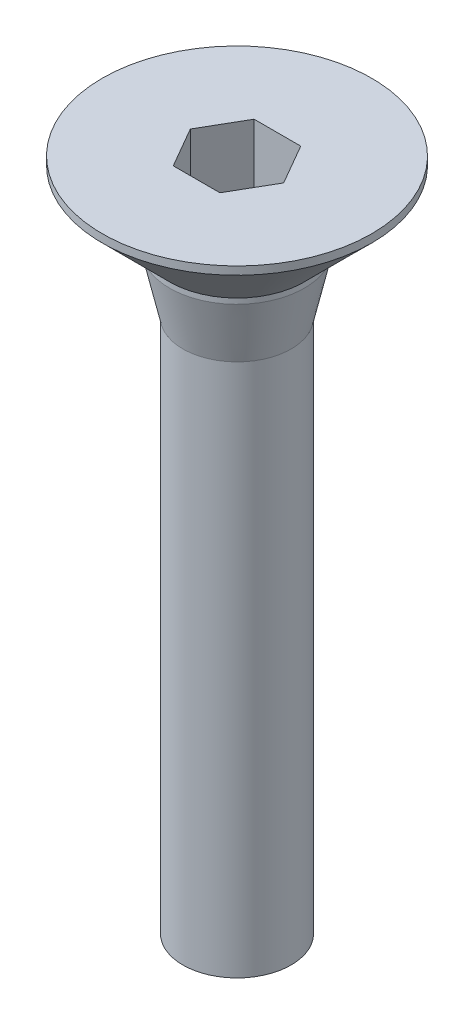
ISO-10303-21;
HEADER;
FILE_DESCRIPTION(('STEP AP214'),'2;1');
FILE_NAME('part.step','',(''),(''),'','','');
FILE_SCHEMA(('AUTOMOTIVE_DESIGN { 1 0 10303 214 1 1 1 1 }'));
ENDSEC;
DATA;
#1=APPLICATION_CONTEXT('core data for automotive mechanical design processes');
#2=APPLICATION_PROTOCOL_DEFINITION('international standard','automotive_design',2000,#1);
#3=PRODUCT_CONTEXT('',#1,'mechanical');
#4=PRODUCT('Part','Part','',(#3));
#5=PRODUCT_RELATED_PRODUCT_CATEGORY('part','',(#4));
#6=PRODUCT_DEFINITION_FORMATION('','',#4);
#7=PRODUCT_DEFINITION_CONTEXT('part definition',#1,'design');
#8=PRODUCT_DEFINITION('design','',#6,#7);
#9=PRODUCT_DEFINITION_SHAPE('','',#8);
#10=(LENGTH_UNIT() NAMED_UNIT(*) SI_UNIT(.MILLI.,.METRE.));
#11=(NAMED_UNIT(*) PLANE_ANGLE_UNIT() SI_UNIT($,.RADIAN.));
#12=(NAMED_UNIT(*) SI_UNIT($,.STERADIAN.) SOLID_ANGLE_UNIT());
#13=UNCERTAINTY_MEASURE_WITH_UNIT(LENGTH_MEASURE(1.E-05),#10,'distance_accuracy_value','');
#14=(GEOMETRIC_REPRESENTATION_CONTEXT(3) GLOBAL_UNCERTAINTY_ASSIGNED_CONTEXT((#13)) GLOBAL_UNIT_ASSIGNED_CONTEXT((#10,
#11,#12)) REPRESENTATION_CONTEXT('',''));
#15=CARTESIAN_POINT('',(0.,0.,0.));
#16=DIRECTION('',(0.,0.,1.));
#17=DIRECTION('',(1.,0.,0.));
#18=AXIS2_PLACEMENT_3D('',#15,#16,#17);
#19=CARTESIAN_POINT('',(0.,0.,0.));
#20=DIRECTION('',(0.,-1.,0.));
#21=DIRECTION('',(1.,0.,0.));
#22=AXIS2_PLACEMENT_3D('',#19,#20,#21);
#23=PLANE('',#22);
#24=DIRECTION('',(1.,0.,0.));
#25=VECTOR('',#24,1.);
#26=CARTESIAN_POINT('',(-0.866025403784437,0.,1.5));
#27=LINE('',#26,#25);
#28=CARTESIAN_POINT('',(-0.866025403784437,0.,1.5));
#29=VERTEX_POINT('',#28);
#30=CARTESIAN_POINT('',(0.866025403784437,0.,1.5));
#31=VERTEX_POINT('',#30);
#32=EDGE_CURVE('E121',#29,#31,#27,.T.);
#33=ORIENTED_EDGE('',*,*,#32,.F.);
#34=DIRECTION('',(0.499999999999998,0.,0.86602540378444));
#35=VECTOR('',#34,1.);
#36=CARTESIAN_POINT('',(-0.866025403784437,0.,1.5));
#37=LINE('',#36,#35);
#38=CARTESIAN_POINT('',(-1.73205080756887,0.,0.));
#39=VERTEX_POINT('',#38);
#40=EDGE_CURVE('E47',#39,#29,#37,.T.);
#41=ORIENTED_EDGE('',*,*,#40,.F.);
#42=DIRECTION('',(-0.499999999999998,0.,0.86602540378444));
#43=VECTOR('',#42,1.);
#44=CARTESIAN_POINT('',(-0.866025403784438,0.,-1.5));
#45=LINE('',#44,#43);
#46=CARTESIAN_POINT('',(-0.866025403784438,0.,-1.5));
#47=VERTEX_POINT('',#46);
#48=EDGE_CURVE('E130',#47,#39,#45,.T.);
#49=ORIENTED_EDGE('',*,*,#48,.F.);
#50=DIRECTION('',(-1.,0.,0.));
#51=VECTOR('',#50,1.);
#52=CARTESIAN_POINT('',(-0.866025403784438,0.,-1.5));
#53=LINE('',#52,#51);
#54=CARTESIAN_POINT('',(0.866025403784437,0.,-1.5));
#55=VERTEX_POINT('',#54);
#56=EDGE_CURVE('E128',#55,#47,#53,.T.);
#57=ORIENTED_EDGE('',*,*,#56,.F.);
#58=DIRECTION('',(-0.499999999999998,0.,-0.86602540378444));
#59=VECTOR('',#58,1.);
#60=CARTESIAN_POINT('',(0.866025403784437,0.,-1.5));
#61=LINE('',#60,#59);
#62=CARTESIAN_POINT('',(1.73205080756887,0.,0.));
#63=VERTEX_POINT('',#62);
#64=EDGE_CURVE('E95',#63,#55,#61,.T.);
#65=ORIENTED_EDGE('',*,*,#64,.F.);
#66=DIRECTION('',(0.499999999999998,0.,-0.86602540378444));
#67=VECTOR('',#66,1.);
#68=CARTESIAN_POINT('',(0.866025403784437,0.,1.5));
#69=LINE('',#68,#67);
#70=EDGE_CURVE('E124',#31,#63,#69,.T.);
#71=ORIENTED_EDGE('',*,*,#70,.F.);
#72=EDGE_LOOP('',(#33,#41,#49,#57,#65,#71));
#73=FACE_BOUND('',#72,.T.);
#74=CARTESIAN_POINT('',(0.,0.,0.));
#75=DIRECTION('',(0.,1.,0.));
#76=DIRECTION('',(-1.,0.,0.));
#77=AXIS2_PLACEMENT_3D('',#74,#75,#76);
#78=CIRCLE('',#77,5.);
#79=CARTESIAN_POINT('',(-5.,0.,0.));
#80=VERTEX_POINT('',#79);
#81=EDGE_CURVE('E11',#80,#80,#78,.T.);
#82=ORIENTED_EDGE('',*,*,#81,.T.);
#83=EDGE_LOOP('',(#82));
#84=FACE_BOUND('',#83,.T.);
#85=ADVANCED_FACE('F33',(#73,#84),#23,.F.);
#86=CARTESIAN_POINT('',(0.,0.,0.));
#87=DIRECTION('',(0.,1.,0.));
#88=DIRECTION('',(-1.,0.,0.));
#89=AXIS2_PLACEMENT_3D('',#86,#87,#88);
#90=CYLINDRICAL_SURFACE('',#89,5.);
#91=ORIENTED_EDGE('',*,*,#81,.F.);
#92=EDGE_LOOP('',(#91));
#93=FACE_BOUND('',#92,.T.);
#94=CARTESIAN_POINT('',(0.,-0.299999999999969,0.));
#95=DIRECTION('',(0.,1.,0.));
#96=DIRECTION('',(-1.,0.,0.));
#97=AXIS2_PLACEMENT_3D('',#94,#95,#96);
#98=CIRCLE('',#97,5.);
#99=CARTESIAN_POINT('',(-5.,-0.29999999999997,0.));
#100=VERTEX_POINT('',#99);
#101=EDGE_CURVE('E40',#100,#100,#98,.T.);
#102=ORIENTED_EDGE('',*,*,#101,.T.);
#103=EDGE_LOOP('',(#102));
#104=FACE_BOUND('',#103,.T.);
#105=ADVANCED_FACE('F153',(#93,#104),#90,.T.);
#106=CARTESIAN_POINT('',(0.,-2.8,0.));
#107=DIRECTION('',(0.,1.,0.));
#108=DIRECTION('',(-1.,0.,0.));
#109=AXIS2_PLACEMENT_3D('',#106,#107,#108);
#110=CONICAL_SURFACE('',#109,2.5,0.785398163397442);
#111=ORIENTED_EDGE('',*,*,#101,.F.);
#112=EDGE_LOOP('',(#111));
#113=FACE_BOUND('',#112,.T.);
#114=CARTESIAN_POINT('',(0.,-2.8,0.));
#115=DIRECTION('',(0.,1.,0.));
#116=DIRECTION('',(-1.,0.,0.));
#117=AXIS2_PLACEMENT_3D('',#114,#115,#116);
#118=CIRCLE('',#117,2.5);
#119=CARTESIAN_POINT('',(-2.5,-2.8,0.));
#120=VERTEX_POINT('',#119);
#121=EDGE_CURVE('E148',#120,#120,#118,.T.);
#122=ORIENTED_EDGE('',*,*,#121,.T.);
#123=EDGE_LOOP('',(#122));
#124=FACE_BOUND('',#123,.T.);
#125=ADVANCED_FACE('F155',(#113,#124),#110,.T.);
#126=CARTESIAN_POINT('',(0.,0.,0.));
#127=DIRECTION('',(0.,1.,0.));
#128=DIRECTION('',(-1.,0.,0.));
#129=AXIS2_PLACEMENT_3D('',#126,#127,#128);
#130=CYLINDRICAL_SURFACE('',#129,2.5);
#131=ORIENTED_EDGE('',*,*,#121,.F.);
#132=EDGE_LOOP('',(#131));
#133=FACE_BOUND('',#132,.T.);
#134=CARTESIAN_POINT('',(0.,-3.,0.));
#135=DIRECTION('',(0.,1.,0.));
#136=DIRECTION('',(-1.,0.,0.));
#137=AXIS2_PLACEMENT_3D('',#134,#135,#136);
#138=CIRCLE('',#137,2.5);
#139=CARTESIAN_POINT('',(-2.5,-3.,0.));
#140=VERTEX_POINT('',#139);
#141=EDGE_CURVE('E145',#140,#140,#138,.T.);
#142=ORIENTED_EDGE('',*,*,#141,.T.);
#143=EDGE_LOOP('',(#142));
#144=FACE_BOUND('',#143,.T.);
#145=ADVANCED_FACE('F158',(#133,#144),#130,.T.);
#146=CARTESIAN_POINT('',(0.,-5.2,0.));
#147=DIRECTION('',(0.,1.,0.));
#148=DIRECTION('',(-1.,0.,0.));
#149=AXIS2_PLACEMENT_3D('',#146,#147,#148);
#150=CONICAL_SURFACE('',#149,2.0095,0.219366698515627);
#151=ORIENTED_EDGE('',*,*,#141,.F.);
#152=EDGE_LOOP('',(#151));
#153=FACE_BOUND('',#152,.T.);
#154=CARTESIAN_POINT('',(0.,-5.2,0.));
#155=DIRECTION('',(0.,1.,0.));
#156=DIRECTION('',(-1.,0.,0.));
#157=AXIS2_PLACEMENT_3D('',#154,#155,#156);
#158=CIRCLE('',#157,2.0095);
#159=CARTESIAN_POINT('',(-2.0095,-5.2,0.));
#160=VERTEX_POINT('',#159);
#161=EDGE_CURVE('E142',#160,#160,#158,.T.);
#162=ORIENTED_EDGE('',*,*,#161,.T.);
#163=EDGE_LOOP('',(#162));
#164=FACE_BOUND('',#163,.T.);
#165=ADVANCED_FACE('F164',(#153,#164),#150,.T.);
#166=CARTESIAN_POINT('',(0.,0.,0.));
#167=DIRECTION('',(0.,1.,0.));
#168=DIRECTION('',(-1.,0.,0.));
#169=AXIS2_PLACEMENT_3D('',#166,#167,#168);
#170=CYLINDRICAL_SURFACE('',#169,2.0095);
#171=ORIENTED_EDGE('',*,*,#161,.F.);
#172=EDGE_LOOP('',(#171));
#173=FACE_BOUND('',#172,.T.);
#174=CARTESIAN_POINT('',(0.,-25.,0.));
#175=DIRECTION('',(0.,1.,0.));
#176=DIRECTION('',(-1.,0.,0.));
#177=AXIS2_PLACEMENT_3D('',#174,#175,#176);
#178=CIRCLE('',#177,2.0095);
#179=CARTESIAN_POINT('',(-2.0095,-25.,0.));
#180=VERTEX_POINT('',#179);
#181=EDGE_CURVE('E134',#180,#180,#178,.T.);
#182=ORIENTED_EDGE('',*,*,#181,.T.);
#183=EDGE_LOOP('',(#182));
#184=FACE_BOUND('',#183,.T.);
#185=ADVANCED_FACE('F170',(#173,#184),#170,.T.);
#186=CARTESIAN_POINT('',(2.0095,-25.,0.));
#187=DIRECTION('',(0.,1.,0.));
#188=DIRECTION('',(-1.,0.,0.));
#189=AXIS2_PLACEMENT_3D('',#186,#187,#188);
#190=PLANE('',#189);
#191=ORIENTED_EDGE('',*,*,#181,.F.);
#192=EDGE_LOOP('',(#191));
#193=FACE_BOUND('',#192,.T.);
#194=ADVANCED_FACE('F176',(#193),#190,.F.);
#195=CARTESIAN_POINT('',(-0.866025403784437,-5.3,1.5));
#196=DIRECTION('',(-0.86602540378444,0.,0.499999999999998));
#197=DIRECTION('',(0.499999999999998,0.,0.86602540378444));
#198=AXIS2_PLACEMENT_3D('',#195,#196,#197);
#199=PLANE('',#198);
#200=ORIENTED_EDGE('',*,*,#40,.T.);
#201=DIRECTION('',(0.,1.,0.));
#202=VECTOR('',#201,1.);
#203=CARTESIAN_POINT('',(-0.866025403784437,-5.3,1.5));
#204=LINE('',#203,#202);
#205=CARTESIAN_POINT('',(-0.866025403784437,-5.3,1.5));
#206=VERTEX_POINT('',#205);
#207=EDGE_CURVE('E77',#206,#29,#204,.T.);
#208=ORIENTED_EDGE('',*,*,#207,.F.);
#209=DIRECTION('',(0.499999999999998,0.,0.86602540378444));
#210=VECTOR('',#209,1.);
#211=CARTESIAN_POINT('',(-0.866025403784437,-5.3,1.5));
#212=LINE('',#211,#210);
#213=CARTESIAN_POINT('',(-1.73205080756887,-5.3,0.));
#214=VERTEX_POINT('',#213);
#215=EDGE_CURVE('E132',#214,#206,#212,.T.);
#216=ORIENTED_EDGE('',*,*,#215,.F.);
#217=DIRECTION('',(0.,1.,0.));
#218=VECTOR('',#217,1.);
#219=CARTESIAN_POINT('',(-1.73205080756887,-5.3,0.));
#220=LINE('',#219,#218);
#221=EDGE_CURVE('E55',#214,#39,#220,.T.);
#222=ORIENTED_EDGE('',*,*,#221,.T.);
#223=EDGE_LOOP('',(#200,#208,#216,#222));
#224=FACE_BOUND('',#223,.T.);
#225=ADVANCED_FACE('F181',(#224),#199,.F.);
#226=CARTESIAN_POINT('',(-0.866025403784438,-5.3,-1.5));
#227=DIRECTION('',(-0.86602540378444,0.,-0.499999999999998));
#228=DIRECTION('',(-0.499999999999998,0.,0.86602540378444));
#229=AXIS2_PLACEMENT_3D('',#226,#227,#228);
#230=PLANE('',#229);
#231=ORIENTED_EDGE('',*,*,#48,.T.);
#232=ORIENTED_EDGE('',*,*,#221,.F.);
#233=DIRECTION('',(-0.499999999999998,0.,0.86602540378444));
#234=VECTOR('',#233,1.);
#235=CARTESIAN_POINT('',(-0.866025403784438,-5.3,-1.5));
#236=LINE('',#235,#234);
#237=CARTESIAN_POINT('',(-0.866025403784438,-5.3,-1.5));
#238=VERTEX_POINT('',#237);
#239=EDGE_CURVE('E107',#238,#214,#236,.T.);
#240=ORIENTED_EDGE('',*,*,#239,.F.);
#241=DIRECTION('',(0.,1.,0.));
#242=VECTOR('',#241,1.);
#243=CARTESIAN_POINT('',(-0.866025403784438,-5.3,-1.5));
#244=LINE('',#243,#242);
#245=EDGE_CURVE('E99',#238,#47,#244,.T.);
#246=ORIENTED_EDGE('',*,*,#245,.T.);
#247=EDGE_LOOP('',(#231,#232,#240,#246));
#248=FACE_BOUND('',#247,.T.);
#249=ADVANCED_FACE('F186',(#248),#230,.F.);
#250=CARTESIAN_POINT('',(-0.866025403784438,-5.3,-1.5));
#251=DIRECTION('',(0.,0.,-1.));
#252=DIRECTION('',(-1.,0.,0.));
#253=AXIS2_PLACEMENT_3D('',#250,#251,#252);
#254=PLANE('',#253);
#255=ORIENTED_EDGE('',*,*,#56,.T.);
#256=ORIENTED_EDGE('',*,*,#245,.F.);
#257=DIRECTION('',(-1.,0.,0.));
#258=VECTOR('',#257,1.);
#259=CARTESIAN_POINT('',(-0.866025403784438,-5.3,-1.5));
#260=LINE('',#259,#258);
#261=CARTESIAN_POINT('',(0.866025403784437,-5.3,-1.5));
#262=VERTEX_POINT('',#261);
#263=EDGE_CURVE('E103',#262,#238,#260,.T.);
#264=ORIENTED_EDGE('',*,*,#263,.F.);
#265=DIRECTION('',(0.,1.,0.));
#266=VECTOR('',#265,1.);
#267=CARTESIAN_POINT('',(0.866025403784437,-5.3,-1.5));
#268=LINE('',#267,#266);
#269=EDGE_CURVE('E88',#262,#55,#268,.T.);
#270=ORIENTED_EDGE('',*,*,#269,.T.);
#271=EDGE_LOOP('',(#255,#256,#264,#270));
#272=FACE_BOUND('',#271,.T.);
#273=ADVANCED_FACE('F104',(#272),#254,.F.);
#274=CARTESIAN_POINT('',(0.866025403784437,-5.3,-1.5));
#275=DIRECTION('',(0.86602540378444,0.,-0.499999999999998));
#276=DIRECTION('',(-0.499999999999998,0.,-0.86602540378444));
#277=AXIS2_PLACEMENT_3D('',#274,#275,#276);
#278=PLANE('',#277);
#279=ORIENTED_EDGE('',*,*,#64,.T.);
#280=ORIENTED_EDGE('',*,*,#269,.F.);
#281=DIRECTION('',(-0.499999999999998,0.,-0.86602540378444));
#282=VECTOR('',#281,1.);
#283=CARTESIAN_POINT('',(0.866025403784437,-5.3,-1.5));
#284=LINE('',#283,#282);
#285=CARTESIAN_POINT('',(1.73205080756887,-5.3,0.));
#286=VERTEX_POINT('',#285);
#287=EDGE_CURVE('E92',#286,#262,#284,.T.);
#288=ORIENTED_EDGE('',*,*,#287,.F.);
#289=DIRECTION('',(0.,1.,0.));
#290=VECTOR('',#289,1.);
#291=CARTESIAN_POINT('',(1.73205080756887,-5.3,0.));
#292=LINE('',#291,#290);
#293=EDGE_CURVE('E100',#286,#63,#292,.T.);
#294=ORIENTED_EDGE('',*,*,#293,.T.);
#295=EDGE_LOOP('',(#279,#280,#288,#294));
#296=FACE_BOUND('',#295,.T.);
#297=ADVANCED_FACE('F90',(#296),#278,.F.);
#298=CARTESIAN_POINT('',(0.866025403784437,-5.3,1.5));
#299=DIRECTION('',(0.86602540378444,0.,0.499999999999998));
#300=DIRECTION('',(0.499999999999998,0.,-0.86602540378444));
#301=AXIS2_PLACEMENT_3D('',#298,#299,#300);
#302=PLANE('',#301);
#303=ORIENTED_EDGE('',*,*,#70,.T.);
#304=ORIENTED_EDGE('',*,*,#293,.F.);
#305=DIRECTION('',(0.499999999999998,0.,-0.86602540378444));
#306=VECTOR('',#305,1.);
#307=CARTESIAN_POINT('',(0.866025403784437,-5.3,1.5));
#308=LINE('',#307,#306);
#309=CARTESIAN_POINT('',(0.866025403784437,-5.3,1.5));
#310=VERTEX_POINT('',#309);
#311=EDGE_CURVE('E113',#310,#286,#308,.T.);
#312=ORIENTED_EDGE('',*,*,#311,.F.);
#313=DIRECTION('',(0.,1.,0.));
#314=VECTOR('',#313,1.);
#315=CARTESIAN_POINT('',(0.866025403784437,-5.3,1.5));
#316=LINE('',#315,#314);
#317=EDGE_CURVE('E137',#310,#31,#316,.T.);
#318=ORIENTED_EDGE('',*,*,#317,.T.);
#319=EDGE_LOOP('',(#303,#304,#312,#318));
#320=FACE_BOUND('',#319,.T.);
#321=ADVANCED_FACE('F212',(#320),#302,.F.);
#322=CARTESIAN_POINT('',(-0.866025403784437,-5.3,1.5));
#323=DIRECTION('',(0.,0.,1.));
#324=DIRECTION('',(1.,0.,0.));
#325=AXIS2_PLACEMENT_3D('',#322,#323,#324);
#326=PLANE('',#325);
#327=ORIENTED_EDGE('',*,*,#32,.T.);
#328=ORIENTED_EDGE('',*,*,#317,.F.);
#329=DIRECTION('',(1.,0.,0.));
#330=VECTOR('',#329,1.);
#331=CARTESIAN_POINT('',(-0.866025403784437,-5.3,1.5));
#332=LINE('',#331,#330);
#333=EDGE_CURVE('E115',#206,#310,#332,.T.);
#334=ORIENTED_EDGE('',*,*,#333,.F.);
#335=ORIENTED_EDGE('',*,*,#207,.T.);
#336=EDGE_LOOP('',(#327,#328,#334,#335));
#337=FACE_BOUND('',#336,.T.);
#338=ADVANCED_FACE('F200',(#337),#326,.F.);
#339=CARTESIAN_POINT('',(-0.866025403784437,-5.3,1.5));
#340=DIRECTION('',(0.,-1.,0.));
#341=DIRECTION('',(0.,0.,-1.));
#342=AXIS2_PLACEMENT_3D('',#339,#340,#341);
#343=PLANE('',#342);
#344=ORIENTED_EDGE('',*,*,#215,.T.);
#345=ORIENTED_EDGE('',*,*,#333,.T.);
#346=ORIENTED_EDGE('',*,*,#311,.T.);
#347=ORIENTED_EDGE('',*,*,#287,.T.);
#348=ORIENTED_EDGE('',*,*,#263,.T.);
#349=ORIENTED_EDGE('',*,*,#239,.T.);
#350=EDGE_LOOP('',(#344,#345,#346,#347,#348,#349));
#351=FACE_BOUND('',#350,.T.);
#352=ADVANCED_FACE('F110',(#351),#343,.F.);
#353=CLOSED_SHELL('',(#85,#105,#125,#145,#165,#185,#194,#225,#249,#273,#297,#321,#338,#352));
#354=MANIFOLD_SOLID_BREP('B2',#353);
#355=ADVANCED_BREP_SHAPE_REPRESENTATION('',(#18,#354),#14);
#356=SHAPE_DEFINITION_REPRESENTATION(#9,#355);
ENDSEC;
END-ISO-10303-21;
